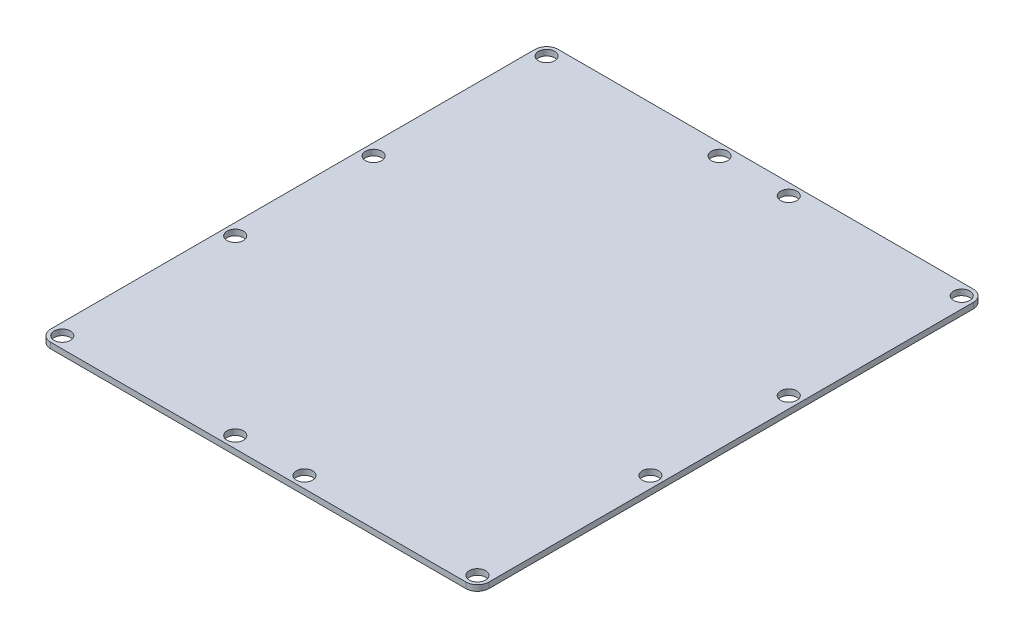
ISO-10303-21;
HEADER;
FILE_DESCRIPTION(('STEP AP214'),'2;1');
FILE_NAME('part.step','',(''),(''),'','','');
FILE_SCHEMA(('AUTOMOTIVE_DESIGN { 1 0 10303 214 1 1 1 1 }'));
ENDSEC;
DATA;
#1=APPLICATION_CONTEXT('core data for automotive mechanical design processes');
#2=APPLICATION_PROTOCOL_DEFINITION('international standard','automotive_design',2000,#1);
#3=PRODUCT_CONTEXT('',#1,'mechanical');
#4=PRODUCT('Part','Part','',(#3));
#5=PRODUCT_RELATED_PRODUCT_CATEGORY('part','',(#4));
#6=PRODUCT_DEFINITION_FORMATION('','',#4);
#7=PRODUCT_DEFINITION_CONTEXT('part definition',#1,'design');
#8=PRODUCT_DEFINITION('design','',#6,#7);
#9=PRODUCT_DEFINITION_SHAPE('','',#8);
#10=(LENGTH_UNIT() NAMED_UNIT(*) SI_UNIT(.MILLI.,.METRE.));
#11=(NAMED_UNIT(*) PLANE_ANGLE_UNIT() SI_UNIT($,.RADIAN.));
#12=(NAMED_UNIT(*) SI_UNIT($,.STERADIAN.) SOLID_ANGLE_UNIT());
#13=UNCERTAINTY_MEASURE_WITH_UNIT(LENGTH_MEASURE(1.E-05),#10,'distance_accuracy_value','');
#14=(GEOMETRIC_REPRESENTATION_CONTEXT(3) GLOBAL_UNCERTAINTY_ASSIGNED_CONTEXT((#13)) GLOBAL_UNIT_ASSIGNED_CONTEXT((#10,
#11,#12)) REPRESENTATION_CONTEXT('',''));
#15=CARTESIAN_POINT('',(0.,0.,0.));
#16=DIRECTION('',(0.,0.,1.));
#17=DIRECTION('',(1.,0.,0.));
#18=AXIS2_PLACEMENT_3D('',#15,#16,#17);
#19=CARTESIAN_POINT('',(-60.325,1.5875,69.85));
#20=DIRECTION('',(1.,0.,0.));
#21=DIRECTION('',(0.,0.,-1.));
#22=AXIS2_PLACEMENT_3D('',#19,#20,#21);
#23=PLANE('',#22);
#24=DIRECTION('',(0.,0.,1.));
#25=VECTOR('',#24,1.);
#26=CARTESIAN_POINT('',(-60.325,0.,69.85));
#27=LINE('',#26,#25);
#28=CARTESIAN_POINT('',(-60.325,0.,-66.675));
#29=VERTEX_POINT('',#28);
#30=CARTESIAN_POINT('',(-60.325,0.,66.675));
#31=VERTEX_POINT('',#30);
#32=EDGE_CURVE('E128',#29,#31,#27,.T.);
#33=ORIENTED_EDGE('',*,*,#32,.T.);
#34=DIRECTION('',(0.,-1.,0.));
#35=VECTOR('',#34,1.);
#36=CARTESIAN_POINT('',(-60.325,1.5875,66.675));
#37=LINE('',#36,#35);
#38=CARTESIAN_POINT('',(-60.325,1.5875,66.675));
#39=VERTEX_POINT('',#38);
#40=EDGE_CURVE('E151',#31,#39,#37,.F.);
#41=ORIENTED_EDGE('',*,*,#40,.T.);
#42=DIRECTION('',(0.,0.,1.));
#43=VECTOR('',#42,1.);
#44=CARTESIAN_POINT('',(-60.325,1.5875,69.85));
#45=LINE('',#44,#43);
#46=CARTESIAN_POINT('',(-60.325,1.5875,-66.675));
#47=VERTEX_POINT('',#46);
#48=EDGE_CURVE('E126',#47,#39,#45,.T.);
#49=ORIENTED_EDGE('',*,*,#48,.F.);
#50=DIRECTION('',(0.,-1.,0.));
#51=VECTOR('',#50,1.);
#52=CARTESIAN_POINT('',(-60.325,1.5875,-66.675));
#53=LINE('',#52,#51);
#54=EDGE_CURVE('E148',#47,#29,#53,.T.);
#55=ORIENTED_EDGE('',*,*,#54,.T.);
#56=EDGE_LOOP('',(#33,#41,#49,#55));
#57=FACE_BOUND('',#56,.T.);
#58=ADVANCED_FACE('F33',(#57),#23,.F.);
#59=CARTESIAN_POINT('',(60.325,1.5875,69.85));
#60=DIRECTION('',(0.,0.,-1.));
#61=DIRECTION('',(-1.,0.,0.));
#62=AXIS2_PLACEMENT_3D('',#59,#60,#61);
#63=PLANE('',#62);
#64=DIRECTION('',(1.,0.,0.));
#65=VECTOR('',#64,1.);
#66=CARTESIAN_POINT('',(60.325,0.,69.85));
#67=LINE('',#66,#65);
#68=CARTESIAN_POINT('',(-57.15,0.,69.85));
#69=VERTEX_POINT('',#68);
#70=CARTESIAN_POINT('',(57.15,0.,69.85));
#71=VERTEX_POINT('',#70);
#72=EDGE_CURVE('E124',#69,#71,#67,.T.);
#73=ORIENTED_EDGE('',*,*,#72,.T.);
#74=DIRECTION('',(0.,-1.,0.));
#75=VECTOR('',#74,1.);
#76=CARTESIAN_POINT('',(57.15,1.5875,69.85));
#77=LINE('',#76,#75);
#78=CARTESIAN_POINT('',(57.15,1.5875,69.85));
#79=VERTEX_POINT('',#78);
#80=EDGE_CURVE('E103',#71,#79,#77,.F.);
#81=ORIENTED_EDGE('',*,*,#80,.T.);
#82=DIRECTION('',(1.,0.,0.));
#83=VECTOR('',#82,1.);
#84=CARTESIAN_POINT('',(60.325,1.5875,69.85));
#85=LINE('',#84,#83);
#86=CARTESIAN_POINT('',(-57.15,1.5875,69.85));
#87=VERTEX_POINT('',#86);
#88=EDGE_CURVE('E167',#87,#79,#85,.T.);
#89=ORIENTED_EDGE('',*,*,#88,.F.);
#90=DIRECTION('',(0.,-1.,0.));
#91=VECTOR('',#90,1.);
#92=CARTESIAN_POINT('',(-57.15,1.5875,69.85));
#93=LINE('',#92,#91);
#94=EDGE_CURVE('E108',#87,#69,#93,.T.);
#95=ORIENTED_EDGE('',*,*,#94,.T.);
#96=EDGE_LOOP('',(#73,#81,#89,#95));
#97=FACE_BOUND('',#96,.T.);
#98=ADVANCED_FACE('F280',(#97),#63,.F.);
#99=CARTESIAN_POINT('',(60.325,1.5875,69.85));
#100=DIRECTION('',(-1.,0.,0.));
#101=DIRECTION('',(0.,0.,1.));
#102=AXIS2_PLACEMENT_3D('',#99,#100,#101);
#103=PLANE('',#102);
#104=DIRECTION('',(0.,0.,-1.));
#105=VECTOR('',#104,1.);
#106=CARTESIAN_POINT('',(60.325,1.5875,69.85));
#107=LINE('',#106,#105);
#108=CARTESIAN_POINT('',(60.325,1.5875,66.675));
#109=VERTEX_POINT('',#108);
#110=CARTESIAN_POINT('',(60.325,1.5875,-66.675));
#111=VERTEX_POINT('',#110);
#112=EDGE_CURVE('E117',#109,#111,#107,.T.);
#113=ORIENTED_EDGE('',*,*,#112,.F.);
#114=DIRECTION('',(0.,-1.,0.));
#115=VECTOR('',#114,1.);
#116=CARTESIAN_POINT('',(60.325,1.5875,66.675));
#117=LINE('',#116,#115);
#118=CARTESIAN_POINT('',(60.325,0.,66.675));
#119=VERTEX_POINT('',#118);
#120=EDGE_CURVE('E102',#109,#119,#117,.T.);
#121=ORIENTED_EDGE('',*,*,#120,.T.);
#122=DIRECTION('',(0.,0.,-1.));
#123=VECTOR('',#122,1.);
#124=CARTESIAN_POINT('',(60.325,0.,69.85));
#125=LINE('',#124,#123);
#126=CARTESIAN_POINT('',(60.325,0.,-66.675));
#127=VERTEX_POINT('',#126);
#128=EDGE_CURVE('E115',#119,#127,#125,.T.);
#129=ORIENTED_EDGE('',*,*,#128,.T.);
#130=DIRECTION('',(0.,-1.,0.));
#131=VECTOR('',#130,1.);
#132=CARTESIAN_POINT('',(60.325,1.5875,-66.675));
#133=LINE('',#132,#131);
#134=EDGE_CURVE('E119',#127,#111,#133,.F.);
#135=ORIENTED_EDGE('',*,*,#134,.T.);
#136=EDGE_LOOP('',(#113,#121,#129,#135));
#137=FACE_BOUND('',#136,.T.);
#138=ADVANCED_FACE('F114',(#137),#103,.F.);
#139=CARTESIAN_POINT('',(60.325,1.5875,-69.85));
#140=DIRECTION('',(0.,0.,1.));
#141=DIRECTION('',(1.,0.,0.));
#142=AXIS2_PLACEMENT_3D('',#139,#140,#141);
#143=PLANE('',#142);
#144=DIRECTION('',(-1.,0.,0.));
#145=VECTOR('',#144,1.);
#146=CARTESIAN_POINT('',(60.325,0.,-69.85));
#147=LINE('',#146,#145);
#148=CARTESIAN_POINT('',(57.15,0.,-69.85));
#149=VERTEX_POINT('',#148);
#150=CARTESIAN_POINT('',(-57.1499999999999,0.,-69.85));
#151=VERTEX_POINT('',#150);
#152=EDGE_CURVE('E123',#149,#151,#147,.T.);
#153=ORIENTED_EDGE('',*,*,#152,.T.);
#154=DIRECTION('',(0.,-1.,0.));
#155=VECTOR('',#154,1.);
#156=CARTESIAN_POINT('',(-57.15,1.5875,-69.85));
#157=LINE('',#156,#155);
#158=CARTESIAN_POINT('',(-57.1499999999999,1.5875,-69.85));
#159=VERTEX_POINT('',#158);
#160=EDGE_CURVE('E11',#151,#159,#157,.F.);
#161=ORIENTED_EDGE('',*,*,#160,.T.);
#162=DIRECTION('',(-1.,0.,0.));
#163=VECTOR('',#162,1.);
#164=CARTESIAN_POINT('',(60.325,1.5875,-69.85));
#165=LINE('',#164,#163);
#166=CARTESIAN_POINT('',(57.15,1.5875,-69.85));
#167=VERTEX_POINT('',#166);
#168=EDGE_CURVE('E132',#167,#159,#165,.T.);
#169=ORIENTED_EDGE('',*,*,#168,.F.);
#170=DIRECTION('',(0.,-1.,0.));
#171=VECTOR('',#170,1.);
#172=CARTESIAN_POINT('',(57.15,1.5875,-69.85));
#173=LINE('',#172,#171);
#174=EDGE_CURVE('E41',#167,#149,#173,.T.);
#175=ORIENTED_EDGE('',*,*,#174,.T.);
#176=EDGE_LOOP('',(#153,#161,#169,#175));
#177=FACE_BOUND('',#176,.T.);
#178=ADVANCED_FACE('F154',(#177),#143,.F.);
#179=CARTESIAN_POINT('',(0.,1.5875,0.));
#180=DIRECTION('',(0.,1.,0.));
#181=DIRECTION('',(0.,0.,1.));
#182=AXIS2_PLACEMENT_3D('',#179,#180,#181);
#183=PLANE('',#182);
#184=CARTESIAN_POINT('',(-57.15,1.5875,-66.675));
#185=DIRECTION('',(0.,1.,0.));
#186=DIRECTION('',(0.,0.,1.));
#187=AXIS2_PLACEMENT_3D('',#184,#185,#186);
#188=CIRCLE('',#187,2.24789999999998);
#189=CARTESIAN_POINT('',(-57.15,1.5875,-64.4271));
#190=VERTEX_POINT('',#189);
#191=EDGE_CURVE('E247',#190,#190,#188,.T.);
#192=ORIENTED_EDGE('',*,*,#191,.F.);
#193=EDGE_LOOP('',(#192));
#194=FACE_BOUND('',#193,.T.);
#195=CARTESIAN_POINT('',(-57.15,1.5875,-19.05));
#196=DIRECTION('',(0.,1.,0.));
#197=DIRECTION('',(0.,0.,1.));
#198=AXIS2_PLACEMENT_3D('',#195,#196,#197);
#199=CIRCLE('',#198,2.24789999999998);
#200=CARTESIAN_POINT('',(-57.15,1.5875,-16.8021));
#201=VERTEX_POINT('',#200);
#202=EDGE_CURVE('E241',#201,#201,#199,.T.);
#203=ORIENTED_EDGE('',*,*,#202,.F.);
#204=EDGE_LOOP('',(#203));
#205=FACE_BOUND('',#204,.T.);
#206=CARTESIAN_POINT('',(-57.15,1.5875,19.05));
#207=DIRECTION('',(0.,1.,0.));
#208=DIRECTION('',(0.,0.,1.));
#209=AXIS2_PLACEMENT_3D('',#206,#207,#208);
#210=CIRCLE('',#209,2.24789999999999);
#211=CARTESIAN_POINT('',(-57.15,1.5875,21.2979));
#212=VERTEX_POINT('',#211);
#213=EDGE_CURVE('E235',#212,#212,#210,.T.);
#214=ORIENTED_EDGE('',*,*,#213,.F.);
#215=EDGE_LOOP('',(#214));
#216=FACE_BOUND('',#215,.T.);
#217=CARTESIAN_POINT('',(-57.15,1.5875,66.675));
#218=DIRECTION('',(0.,1.,0.));
#219=DIRECTION('',(0.,0.,1.));
#220=AXIS2_PLACEMENT_3D('',#217,#218,#219);
#221=CIRCLE('',#220,2.24789999999999);
#222=CARTESIAN_POINT('',(-57.15,1.5875,68.9229));
#223=VERTEX_POINT('',#222);
#224=EDGE_CURVE('E229',#223,#223,#221,.T.);
#225=ORIENTED_EDGE('',*,*,#224,.F.);
#226=EDGE_LOOP('',(#225));
#227=FACE_BOUND('',#226,.T.);
#228=CARTESIAN_POINT('',(-9.52499999999997,1.5875,66.675));
#229=DIRECTION('',(0.,1.,0.));
#230=DIRECTION('',(0.,0.,1.));
#231=AXIS2_PLACEMENT_3D('',#228,#229,#230);
#232=CIRCLE('',#231,2.24789999999999);
#233=CARTESIAN_POINT('',(-9.52499999999997,1.5875,68.9229));
#234=VERTEX_POINT('',#233);
#235=EDGE_CURVE('E223',#234,#234,#232,.T.);
#236=ORIENTED_EDGE('',*,*,#235,.F.);
#237=EDGE_LOOP('',(#236));
#238=FACE_BOUND('',#237,.T.);
#239=CARTESIAN_POINT('',(9.52500000000003,1.5875,66.675));
#240=DIRECTION('',(0.,1.,0.));
#241=DIRECTION('',(0.,0.,1.));
#242=AXIS2_PLACEMENT_3D('',#239,#240,#241);
#243=CIRCLE('',#242,2.24789999999999);
#244=CARTESIAN_POINT('',(9.52500000000003,1.5875,68.9229));
#245=VERTEX_POINT('',#244);
#246=EDGE_CURVE('E217',#245,#245,#243,.T.);
#247=ORIENTED_EDGE('',*,*,#246,.F.);
#248=EDGE_LOOP('',(#247));
#249=FACE_BOUND('',#248,.T.);
#250=CARTESIAN_POINT('',(57.15,1.5875,66.675));
#251=DIRECTION('',(0.,1.,0.));
#252=DIRECTION('',(0.,0.,1.));
#253=AXIS2_PLACEMENT_3D('',#250,#251,#252);
#254=CIRCLE('',#253,2.24789999999998);
#255=CARTESIAN_POINT('',(57.15,1.5875,68.9229));
#256=VERTEX_POINT('',#255);
#257=EDGE_CURVE('E211',#256,#256,#254,.T.);
#258=ORIENTED_EDGE('',*,*,#257,.F.);
#259=EDGE_LOOP('',(#258));
#260=FACE_BOUND('',#259,.T.);
#261=CARTESIAN_POINT('',(57.15,1.5875,19.05));
#262=DIRECTION('',(0.,1.,0.));
#263=DIRECTION('',(0.,0.,1.));
#264=AXIS2_PLACEMENT_3D('',#261,#262,#263);
#265=CIRCLE('',#264,2.24789999999998);
#266=CARTESIAN_POINT('',(57.15,1.5875,21.2979));
#267=VERTEX_POINT('',#266);
#268=EDGE_CURVE('E205',#267,#267,#265,.T.);
#269=ORIENTED_EDGE('',*,*,#268,.F.);
#270=EDGE_LOOP('',(#269));
#271=FACE_BOUND('',#270,.T.);
#272=CARTESIAN_POINT('',(57.15,1.5875,-19.05));
#273=DIRECTION('',(0.,1.,0.));
#274=DIRECTION('',(0.,0.,1.));
#275=AXIS2_PLACEMENT_3D('',#272,#273,#274);
#276=CIRCLE('',#275,2.24789999999998);
#277=CARTESIAN_POINT('',(57.15,1.5875,-16.8021));
#278=VERTEX_POINT('',#277);
#279=EDGE_CURVE('E199',#278,#278,#276,.T.);
#280=ORIENTED_EDGE('',*,*,#279,.F.);
#281=EDGE_LOOP('',(#280));
#282=FACE_BOUND('',#281,.T.);
#283=CARTESIAN_POINT('',(57.15,1.5875,-66.675));
#284=DIRECTION('',(0.,1.,0.));
#285=DIRECTION('',(0.,0.,1.));
#286=AXIS2_PLACEMENT_3D('',#283,#284,#285);
#287=CIRCLE('',#286,2.24789999999998);
#288=CARTESIAN_POINT('',(57.15,1.5875,-64.4271));
#289=VERTEX_POINT('',#288);
#290=EDGE_CURVE('E193',#289,#289,#287,.T.);
#291=ORIENTED_EDGE('',*,*,#290,.F.);
#292=EDGE_LOOP('',(#291));
#293=FACE_BOUND('',#292,.T.);
#294=CARTESIAN_POINT('',(9.52500000000003,1.5875,-66.675));
#295=DIRECTION('',(0.,1.,0.));
#296=DIRECTION('',(0.,0.,1.));
#297=AXIS2_PLACEMENT_3D('',#294,#295,#296);
#298=CIRCLE('',#297,2.24789999999999);
#299=CARTESIAN_POINT('',(9.52500000000003,1.5875,-64.4271));
#300=VERTEX_POINT('',#299);
#301=EDGE_CURVE('E185',#300,#300,#298,.T.);
#302=ORIENTED_EDGE('',*,*,#301,.F.);
#303=EDGE_LOOP('',(#302));
#304=FACE_BOUND('',#303,.T.);
#305=CARTESIAN_POINT('',(-9.52499999999997,1.5875,-66.675));
#306=DIRECTION('',(0.,1.,0.));
#307=DIRECTION('',(0.,0.,1.));
#308=AXIS2_PLACEMENT_3D('',#305,#306,#307);
#309=CIRCLE('',#308,2.24789999999999);
#310=CARTESIAN_POINT('',(-9.52499999999997,1.5875,-64.4271));
#311=VERTEX_POINT('',#310);
#312=EDGE_CURVE('E177',#311,#311,#309,.T.);
#313=ORIENTED_EDGE('',*,*,#312,.F.);
#314=EDGE_LOOP('',(#313));
#315=FACE_BOUND('',#314,.T.);
#316=ORIENTED_EDGE('',*,*,#88,.T.);
#317=CARTESIAN_POINT('',(57.15,1.5875,66.675));
#318=DIRECTION('',(0.,1.,0.));
#319=DIRECTION('',(0.,0.,1.));
#320=AXIS2_PLACEMENT_3D('',#317,#318,#319);
#321=CIRCLE('',#320,3.175);
#322=EDGE_CURVE('E146',#79,#109,#321,.T.);
#323=ORIENTED_EDGE('',*,*,#322,.T.);
#324=ORIENTED_EDGE('',*,*,#112,.T.);
#325=CARTESIAN_POINT('',(57.15,1.5875,-66.675));
#326=DIRECTION('',(0.,1.,0.));
#327=DIRECTION('',(0.,0.,1.));
#328=AXIS2_PLACEMENT_3D('',#325,#326,#327);
#329=CIRCLE('',#328,3.175);
#330=EDGE_CURVE('E53',#111,#167,#329,.T.);
#331=ORIENTED_EDGE('',*,*,#330,.T.);
#332=ORIENTED_EDGE('',*,*,#168,.T.);
#333=CARTESIAN_POINT('',(-57.15,1.5875,-66.675));
#334=DIRECTION('',(0.,1.,0.));
#335=DIRECTION('',(0.,0.,1.));
#336=AXIS2_PLACEMENT_3D('',#333,#334,#335);
#337=CIRCLE('',#336,3.175);
#338=EDGE_CURVE('E142',#159,#47,#337,.T.);
#339=ORIENTED_EDGE('',*,*,#338,.T.);
#340=ORIENTED_EDGE('',*,*,#48,.T.);
#341=CARTESIAN_POINT('',(-57.15,1.5875,66.675));
#342=DIRECTION('',(0.,1.,0.));
#343=DIRECTION('',(0.,0.,1.));
#344=AXIS2_PLACEMENT_3D('',#341,#342,#343);
#345=CIRCLE('',#344,3.175);
#346=EDGE_CURVE('E144',#39,#87,#345,.T.);
#347=ORIENTED_EDGE('',*,*,#346,.T.);
#348=EDGE_LOOP('',(#316,#323,#324,#331,#332,#339,#340,#347));
#349=FACE_BOUND('',#348,.T.);
#350=ADVANCED_FACE('F253',(#194,#205,#216,#227,#238,#249,#260,#271,#282,#293,#304,#315,#349),
#183,.T.);
#351=CARTESIAN_POINT('',(0.,0.,0.));
#352=DIRECTION('',(0.,1.,0.));
#353=DIRECTION('',(0.,0.,1.));
#354=AXIS2_PLACEMENT_3D('',#351,#352,#353);
#355=PLANE('',#354);
#356=CARTESIAN_POINT('',(-57.15,0.,-66.675));
#357=DIRECTION('',(0.,1.,0.));
#358=DIRECTION('',(0.,0.,1.));
#359=AXIS2_PLACEMENT_3D('',#356,#357,#358);
#360=CIRCLE('',#359,2.24789999999999);
#361=CARTESIAN_POINT('',(-57.15,0.,-64.4271));
#362=VERTEX_POINT('',#361);
#363=EDGE_CURVE('E244',#362,#362,#360,.T.);
#364=ORIENTED_EDGE('',*,*,#363,.T.);
#365=EDGE_LOOP('',(#364));
#366=FACE_BOUND('',#365,.T.);
#367=CARTESIAN_POINT('',(-57.15,0.,-19.05));
#368=DIRECTION('',(0.,1.,0.));
#369=DIRECTION('',(0.,0.,1.));
#370=AXIS2_PLACEMENT_3D('',#367,#368,#369);
#371=CIRCLE('',#370,2.24789999999999);
#372=CARTESIAN_POINT('',(-57.15,0.,-16.8021));
#373=VERTEX_POINT('',#372);
#374=EDGE_CURVE('E238',#373,#373,#371,.T.);
#375=ORIENTED_EDGE('',*,*,#374,.T.);
#376=EDGE_LOOP('',(#375));
#377=FACE_BOUND('',#376,.T.);
#378=CARTESIAN_POINT('',(-57.15,0.,19.05));
#379=DIRECTION('',(0.,1.,0.));
#380=DIRECTION('',(0.,0.,1.));
#381=AXIS2_PLACEMENT_3D('',#378,#379,#380);
#382=CIRCLE('',#381,2.24789999999999);
#383=CARTESIAN_POINT('',(-57.15,0.,21.2979));
#384=VERTEX_POINT('',#383);
#385=EDGE_CURVE('E232',#384,#384,#382,.T.);
#386=ORIENTED_EDGE('',*,*,#385,.T.);
#387=EDGE_LOOP('',(#386));
#388=FACE_BOUND('',#387,.T.);
#389=CARTESIAN_POINT('',(-57.15,0.,66.675));
#390=DIRECTION('',(0.,1.,0.));
#391=DIRECTION('',(0.,0.,1.));
#392=AXIS2_PLACEMENT_3D('',#389,#390,#391);
#393=CIRCLE('',#392,2.24789999999999);
#394=CARTESIAN_POINT('',(-57.15,0.,68.9229));
#395=VERTEX_POINT('',#394);
#396=EDGE_CURVE('E226',#395,#395,#393,.T.);
#397=ORIENTED_EDGE('',*,*,#396,.T.);
#398=EDGE_LOOP('',(#397));
#399=FACE_BOUND('',#398,.T.);
#400=CARTESIAN_POINT('',(-9.52499999999997,0.,66.675));
#401=DIRECTION('',(0.,1.,0.));
#402=DIRECTION('',(0.,0.,1.));
#403=AXIS2_PLACEMENT_3D('',#400,#401,#402);
#404=CIRCLE('',#403,2.24789999999999);
#405=CARTESIAN_POINT('',(-9.52499999999997,0.,68.9229));
#406=VERTEX_POINT('',#405);
#407=EDGE_CURVE('E220',#406,#406,#404,.T.);
#408=ORIENTED_EDGE('',*,*,#407,.T.);
#409=EDGE_LOOP('',(#408));
#410=FACE_BOUND('',#409,.T.);
#411=CARTESIAN_POINT('',(9.52500000000003,0.,66.675));
#412=DIRECTION('',(0.,1.,0.));
#413=DIRECTION('',(0.,0.,1.));
#414=AXIS2_PLACEMENT_3D('',#411,#412,#413);
#415=CIRCLE('',#414,2.24789999999999);
#416=CARTESIAN_POINT('',(9.52500000000003,0.,68.9229));
#417=VERTEX_POINT('',#416);
#418=EDGE_CURVE('E214',#417,#417,#415,.T.);
#419=ORIENTED_EDGE('',*,*,#418,.T.);
#420=EDGE_LOOP('',(#419));
#421=FACE_BOUND('',#420,.T.);
#422=CARTESIAN_POINT('',(57.15,0.,66.675));
#423=DIRECTION('',(0.,1.,0.));
#424=DIRECTION('',(0.,0.,1.));
#425=AXIS2_PLACEMENT_3D('',#422,#423,#424);
#426=CIRCLE('',#425,2.24789999999999);
#427=CARTESIAN_POINT('',(57.15,0.,68.9229));
#428=VERTEX_POINT('',#427);
#429=EDGE_CURVE('E208',#428,#428,#426,.T.);
#430=ORIENTED_EDGE('',*,*,#429,.T.);
#431=EDGE_LOOP('',(#430));
#432=FACE_BOUND('',#431,.T.);
#433=CARTESIAN_POINT('',(57.15,0.,19.05));
#434=DIRECTION('',(0.,1.,0.));
#435=DIRECTION('',(0.,0.,1.));
#436=AXIS2_PLACEMENT_3D('',#433,#434,#435);
#437=CIRCLE('',#436,2.24789999999999);
#438=CARTESIAN_POINT('',(57.15,0.,21.2979));
#439=VERTEX_POINT('',#438);
#440=EDGE_CURVE('E202',#439,#439,#437,.T.);
#441=ORIENTED_EDGE('',*,*,#440,.T.);
#442=EDGE_LOOP('',(#441));
#443=FACE_BOUND('',#442,.T.);
#444=CARTESIAN_POINT('',(57.15,0.,-19.05));
#445=DIRECTION('',(0.,1.,0.));
#446=DIRECTION('',(0.,0.,1.));
#447=AXIS2_PLACEMENT_3D('',#444,#445,#446);
#448=CIRCLE('',#447,2.24789999999999);
#449=CARTESIAN_POINT('',(57.15,0.,-16.8021));
#450=VERTEX_POINT('',#449);
#451=EDGE_CURVE('E196',#450,#450,#448,.T.);
#452=ORIENTED_EDGE('',*,*,#451,.T.);
#453=EDGE_LOOP('',(#452));
#454=FACE_BOUND('',#453,.T.);
#455=CARTESIAN_POINT('',(57.15,0.,-66.675));
#456=DIRECTION('',(0.,1.,0.));
#457=DIRECTION('',(0.,0.,1.));
#458=AXIS2_PLACEMENT_3D('',#455,#456,#457);
#459=CIRCLE('',#458,2.24789999999999);
#460=CARTESIAN_POINT('',(57.15,0.,-64.4271));
#461=VERTEX_POINT('',#460);
#462=EDGE_CURVE('E190',#461,#461,#459,.T.);
#463=ORIENTED_EDGE('',*,*,#462,.T.);
#464=EDGE_LOOP('',(#463));
#465=FACE_BOUND('',#464,.T.);
#466=CARTESIAN_POINT('',(9.52500000000003,0.,-66.675));
#467=DIRECTION('',(0.,1.,0.));
#468=DIRECTION('',(0.,0.,1.));
#469=AXIS2_PLACEMENT_3D('',#466,#467,#468);
#470=CIRCLE('',#469,2.24789999999999);
#471=CARTESIAN_POINT('',(9.52500000000003,0.,-64.4271));
#472=VERTEX_POINT('',#471);
#473=EDGE_CURVE('E181',#472,#472,#470,.T.);
#474=ORIENTED_EDGE('',*,*,#473,.T.);
#475=EDGE_LOOP('',(#474));
#476=FACE_BOUND('',#475,.T.);
#477=CARTESIAN_POINT('',(-9.52499999999997,0.,-66.675));
#478=DIRECTION('',(0.,1.,0.));
#479=DIRECTION('',(0.,0.,1.));
#480=AXIS2_PLACEMENT_3D('',#477,#478,#479);
#481=CIRCLE('',#480,2.24789999999999);
#482=CARTESIAN_POINT('',(-9.52499999999997,0.,-64.4271));
#483=VERTEX_POINT('',#482);
#484=EDGE_CURVE('E172',#483,#483,#481,.T.);
#485=ORIENTED_EDGE('',*,*,#484,.T.);
#486=EDGE_LOOP('',(#485));
#487=FACE_BOUND('',#486,.T.);
#488=ORIENTED_EDGE('',*,*,#128,.F.);
#489=CARTESIAN_POINT('',(57.15,0.,66.675));
#490=DIRECTION('',(0.,1.,0.));
#491=DIRECTION('',(0.,0.,1.));
#492=AXIS2_PLACEMENT_3D('',#489,#490,#491);
#493=CIRCLE('',#492,3.175);
#494=EDGE_CURVE('E98',#119,#71,#493,.F.);
#495=ORIENTED_EDGE('',*,*,#494,.T.);
#496=ORIENTED_EDGE('',*,*,#72,.F.);
#497=CARTESIAN_POINT('',(-57.15,0.,66.675));
#498=DIRECTION('',(0.,1.,0.));
#499=DIRECTION('',(0.,0.,1.));
#500=AXIS2_PLACEMENT_3D('',#497,#498,#499);
#501=CIRCLE('',#500,3.175);
#502=EDGE_CURVE('E109',#69,#31,#501,.F.);
#503=ORIENTED_EDGE('',*,*,#502,.T.);
#504=ORIENTED_EDGE('',*,*,#32,.F.);
#505=CARTESIAN_POINT('',(-57.15,0.,-66.675));
#506=DIRECTION('',(0.,1.,0.));
#507=DIRECTION('',(0.,0.,1.));
#508=AXIS2_PLACEMENT_3D('',#505,#506,#507);
#509=CIRCLE('',#508,3.175);
#510=EDGE_CURVE('E135',#29,#151,#509,.F.);
#511=ORIENTED_EDGE('',*,*,#510,.T.);
#512=ORIENTED_EDGE('',*,*,#152,.F.);
#513=CARTESIAN_POINT('',(57.15,0.,-66.675));
#514=DIRECTION('',(0.,1.,0.));
#515=DIRECTION('',(0.,0.,1.));
#516=AXIS2_PLACEMENT_3D('',#513,#514,#515);
#517=CIRCLE('',#516,3.175);
#518=EDGE_CURVE('E118',#149,#127,#517,.F.);
#519=ORIENTED_EDGE('',*,*,#518,.T.);
#520=EDGE_LOOP('',(#488,#495,#496,#503,#504,#511,#512,#519));
#521=FACE_BOUND('',#520,.T.);
#522=ADVANCED_FACE('F121',(#366,#377,#388,#399,#410,#421,#432,#443,#454,#465,#476,#487,#521),
#355,.F.);
#523=CARTESIAN_POINT('',(-9.52499999999997,1.5875,-66.675));
#524=DIRECTION('',(0.,1.,0.));
#525=DIRECTION('',(0.,0.,1.));
#526=AXIS2_PLACEMENT_3D('',#523,#524,#525);
#527=CYLINDRICAL_SURFACE('',#526,2.24789999999999);
#528=ORIENTED_EDGE('',*,*,#484,.F.);
#529=EDGE_LOOP('',(#528));
#530=FACE_BOUND('',#529,.T.);
#531=ORIENTED_EDGE('',*,*,#312,.T.);
#532=EDGE_LOOP('',(#531));
#533=FACE_BOUND('',#532,.T.);
#534=ADVANCED_FACE('F302',(#530,#533),#527,.F.);
#535=CARTESIAN_POINT('',(9.52500000000003,1.5875,-66.675));
#536=DIRECTION('',(0.,1.,0.));
#537=DIRECTION('',(0.,0.,1.));
#538=AXIS2_PLACEMENT_3D('',#535,#536,#537);
#539=CYLINDRICAL_SURFACE('',#538,2.24789999999999);
#540=ORIENTED_EDGE('',*,*,#473,.F.);
#541=EDGE_LOOP('',(#540));
#542=FACE_BOUND('',#541,.T.);
#543=ORIENTED_EDGE('',*,*,#301,.T.);
#544=EDGE_LOOP('',(#543));
#545=FACE_BOUND('',#544,.T.);
#546=ADVANCED_FACE('F307',(#542,#545),#539,.F.);
#547=CARTESIAN_POINT('',(57.15,1.5875,-66.675));
#548=DIRECTION('',(0.,1.,0.));
#549=DIRECTION('',(0.,0.,1.));
#550=AXIS2_PLACEMENT_3D('',#547,#548,#549);
#551=CYLINDRICAL_SURFACE('',#550,2.24789999999999);
#552=ORIENTED_EDGE('',*,*,#462,.F.);
#553=EDGE_LOOP('',(#552));
#554=FACE_BOUND('',#553,.T.);
#555=ORIENTED_EDGE('',*,*,#290,.T.);
#556=EDGE_LOOP('',(#555));
#557=FACE_BOUND('',#556,.T.);
#558=ADVANCED_FACE('F311',(#554,#557),#551,.F.);
#559=CARTESIAN_POINT('',(57.15,1.5875,-19.05));
#560=DIRECTION('',(0.,1.,0.));
#561=DIRECTION('',(0.,0.,1.));
#562=AXIS2_PLACEMENT_3D('',#559,#560,#561);
#563=CYLINDRICAL_SURFACE('',#562,2.24789999999999);
#564=ORIENTED_EDGE('',*,*,#451,.F.);
#565=EDGE_LOOP('',(#564));
#566=FACE_BOUND('',#565,.T.);
#567=ORIENTED_EDGE('',*,*,#279,.T.);
#568=EDGE_LOOP('',(#567));
#569=FACE_BOUND('',#568,.T.);
#570=ADVANCED_FACE('F315',(#566,#569),#563,.F.);
#571=CARTESIAN_POINT('',(57.15,1.5875,19.05));
#572=DIRECTION('',(0.,1.,0.));
#573=DIRECTION('',(0.,0.,1.));
#574=AXIS2_PLACEMENT_3D('',#571,#572,#573);
#575=CYLINDRICAL_SURFACE('',#574,2.24789999999999);
#576=ORIENTED_EDGE('',*,*,#440,.F.);
#577=EDGE_LOOP('',(#576));
#578=FACE_BOUND('',#577,.T.);
#579=ORIENTED_EDGE('',*,*,#268,.T.);
#580=EDGE_LOOP('',(#579));
#581=FACE_BOUND('',#580,.T.);
#582=ADVANCED_FACE('F319',(#578,#581),#575,.F.);
#583=CARTESIAN_POINT('',(57.15,1.5875,66.675));
#584=DIRECTION('',(0.,1.,0.));
#585=DIRECTION('',(0.,0.,1.));
#586=AXIS2_PLACEMENT_3D('',#583,#584,#585);
#587=CYLINDRICAL_SURFACE('',#586,2.24789999999999);
#588=ORIENTED_EDGE('',*,*,#429,.F.);
#589=EDGE_LOOP('',(#588));
#590=FACE_BOUND('',#589,.T.);
#591=ORIENTED_EDGE('',*,*,#257,.T.);
#592=EDGE_LOOP('',(#591));
#593=FACE_BOUND('',#592,.T.);
#594=ADVANCED_FACE('F323',(#590,#593),#587,.F.);
#595=CARTESIAN_POINT('',(9.52500000000003,1.5875,66.675));
#596=DIRECTION('',(0.,1.,0.));
#597=DIRECTION('',(0.,0.,1.));
#598=AXIS2_PLACEMENT_3D('',#595,#596,#597);
#599=CYLINDRICAL_SURFACE('',#598,2.24789999999999);
#600=ORIENTED_EDGE('',*,*,#418,.F.);
#601=EDGE_LOOP('',(#600));
#602=FACE_BOUND('',#601,.T.);
#603=ORIENTED_EDGE('',*,*,#246,.T.);
#604=EDGE_LOOP('',(#603));
#605=FACE_BOUND('',#604,.T.);
#606=ADVANCED_FACE('F327',(#602,#605),#599,.F.);
#607=CARTESIAN_POINT('',(-9.52499999999997,1.5875,66.675));
#608=DIRECTION('',(0.,1.,0.));
#609=DIRECTION('',(0.,0.,1.));
#610=AXIS2_PLACEMENT_3D('',#607,#608,#609);
#611=CYLINDRICAL_SURFACE('',#610,2.24789999999999);
#612=ORIENTED_EDGE('',*,*,#407,.F.);
#613=EDGE_LOOP('',(#612));
#614=FACE_BOUND('',#613,.T.);
#615=ORIENTED_EDGE('',*,*,#235,.T.);
#616=EDGE_LOOP('',(#615));
#617=FACE_BOUND('',#616,.T.);
#618=ADVANCED_FACE('F331',(#614,#617),#611,.F.);
#619=CARTESIAN_POINT('',(-57.15,1.5875,66.675));
#620=DIRECTION('',(0.,1.,0.));
#621=DIRECTION('',(0.,0.,1.));
#622=AXIS2_PLACEMENT_3D('',#619,#620,#621);
#623=CYLINDRICAL_SURFACE('',#622,2.24789999999999);
#624=ORIENTED_EDGE('',*,*,#396,.F.);
#625=EDGE_LOOP('',(#624));
#626=FACE_BOUND('',#625,.T.);
#627=ORIENTED_EDGE('',*,*,#224,.T.);
#628=EDGE_LOOP('',(#627));
#629=FACE_BOUND('',#628,.T.);
#630=ADVANCED_FACE('F335',(#626,#629),#623,.F.);
#631=CARTESIAN_POINT('',(-57.15,1.5875,19.05));
#632=DIRECTION('',(0.,1.,0.));
#633=DIRECTION('',(0.,0.,1.));
#634=AXIS2_PLACEMENT_3D('',#631,#632,#633);
#635=CYLINDRICAL_SURFACE('',#634,2.24789999999999);
#636=ORIENTED_EDGE('',*,*,#385,.F.);
#637=EDGE_LOOP('',(#636));
#638=FACE_BOUND('',#637,.T.);
#639=ORIENTED_EDGE('',*,*,#213,.T.);
#640=EDGE_LOOP('',(#639));
#641=FACE_BOUND('',#640,.T.);
#642=ADVANCED_FACE('F339',(#638,#641),#635,.F.);
#643=CARTESIAN_POINT('',(-57.15,1.5875,-19.05));
#644=DIRECTION('',(0.,1.,0.));
#645=DIRECTION('',(0.,0.,1.));
#646=AXIS2_PLACEMENT_3D('',#643,#644,#645);
#647=CYLINDRICAL_SURFACE('',#646,2.24789999999999);
#648=ORIENTED_EDGE('',*,*,#374,.F.);
#649=EDGE_LOOP('',(#648));
#650=FACE_BOUND('',#649,.T.);
#651=ORIENTED_EDGE('',*,*,#202,.T.);
#652=EDGE_LOOP('',(#651));
#653=FACE_BOUND('',#652,.T.);
#654=ADVANCED_FACE('F343',(#650,#653),#647,.F.);
#655=CARTESIAN_POINT('',(-57.15,1.5875,-66.675));
#656=DIRECTION('',(0.,1.,0.));
#657=DIRECTION('',(0.,0.,1.));
#658=AXIS2_PLACEMENT_3D('',#655,#656,#657);
#659=CYLINDRICAL_SURFACE('',#658,2.24789999999999);
#660=ORIENTED_EDGE('',*,*,#363,.F.);
#661=EDGE_LOOP('',(#660));
#662=FACE_BOUND('',#661,.T.);
#663=ORIENTED_EDGE('',*,*,#191,.T.);
#664=EDGE_LOOP('',(#663));
#665=FACE_BOUND('',#664,.T.);
#666=ADVANCED_FACE('F251',(#662,#665),#659,.F.);
#667=CARTESIAN_POINT('',(57.15,1.5875,66.675));
#668=DIRECTION('',(0.,-1.,0.));
#669=DIRECTION('',(0.,0.,-1.));
#670=AXIS2_PLACEMENT_3D('',#667,#668,#669);
#671=CYLINDRICAL_SURFACE('',#670,3.175);
#672=ORIENTED_EDGE('',*,*,#322,.F.);
#673=ORIENTED_EDGE('',*,*,#80,.F.);
#674=ORIENTED_EDGE('',*,*,#494,.F.);
#675=ORIENTED_EDGE('',*,*,#120,.F.);
#676=EDGE_LOOP('',(#672,#673,#674,#675));
#677=FACE_BOUND('',#676,.T.);
#678=ADVANCED_FACE('F101',(#677),#671,.T.);
#679=CARTESIAN_POINT('',(-57.15,1.5875,66.675));
#680=DIRECTION('',(0.,-1.,0.));
#681=DIRECTION('',(0.,0.,-1.));
#682=AXIS2_PLACEMENT_3D('',#679,#680,#681);
#683=CYLINDRICAL_SURFACE('',#682,3.175);
#684=ORIENTED_EDGE('',*,*,#346,.F.);
#685=ORIENTED_EDGE('',*,*,#40,.F.);
#686=ORIENTED_EDGE('',*,*,#502,.F.);
#687=ORIENTED_EDGE('',*,*,#94,.F.);
#688=EDGE_LOOP('',(#684,#685,#686,#687));
#689=FACE_BOUND('',#688,.T.);
#690=ADVANCED_FACE('F282',(#689),#683,.T.);
#691=CARTESIAN_POINT('',(-57.15,1.5875,-66.675));
#692=DIRECTION('',(0.,-1.,0.));
#693=DIRECTION('',(0.,0.,-1.));
#694=AXIS2_PLACEMENT_3D('',#691,#692,#693);
#695=CYLINDRICAL_SURFACE('',#694,3.175);
#696=ORIENTED_EDGE('',*,*,#338,.F.);
#697=ORIENTED_EDGE('',*,*,#160,.F.);
#698=ORIENTED_EDGE('',*,*,#510,.F.);
#699=ORIENTED_EDGE('',*,*,#54,.F.);
#700=EDGE_LOOP('',(#696,#697,#698,#699));
#701=FACE_BOUND('',#700,.T.);
#702=ADVANCED_FACE('F161',(#701),#695,.T.);
#703=CARTESIAN_POINT('',(57.15,1.5875,-66.675));
#704=DIRECTION('',(0.,-1.,0.));
#705=DIRECTION('',(0.,0.,-1.));
#706=AXIS2_PLACEMENT_3D('',#703,#704,#705);
#707=CYLINDRICAL_SURFACE('',#706,3.175);
#708=ORIENTED_EDGE('',*,*,#330,.F.);
#709=ORIENTED_EDGE('',*,*,#134,.F.);
#710=ORIENTED_EDGE('',*,*,#518,.F.);
#711=ORIENTED_EDGE('',*,*,#174,.F.);
#712=EDGE_LOOP('',(#708,#709,#710,#711));
#713=FACE_BOUND('',#712,.T.);
#714=ADVANCED_FACE('F35',(#713),#707,.T.);
#715=CLOSED_SHELL('',(#58,#98,#138,#178,#350,#522,#534,#546,#558,#570,#582,#594,#606,#618,#630,
#642,#654,#666,#678,#690,#702,#714));
#716=MANIFOLD_SOLID_BREP('B2',#715);
#717=ADVANCED_BREP_SHAPE_REPRESENTATION('',(#18,#716),#14);
#718=SHAPE_DEFINITION_REPRESENTATION(#9,#717);
ENDSEC;
END-ISO-10303-21;
